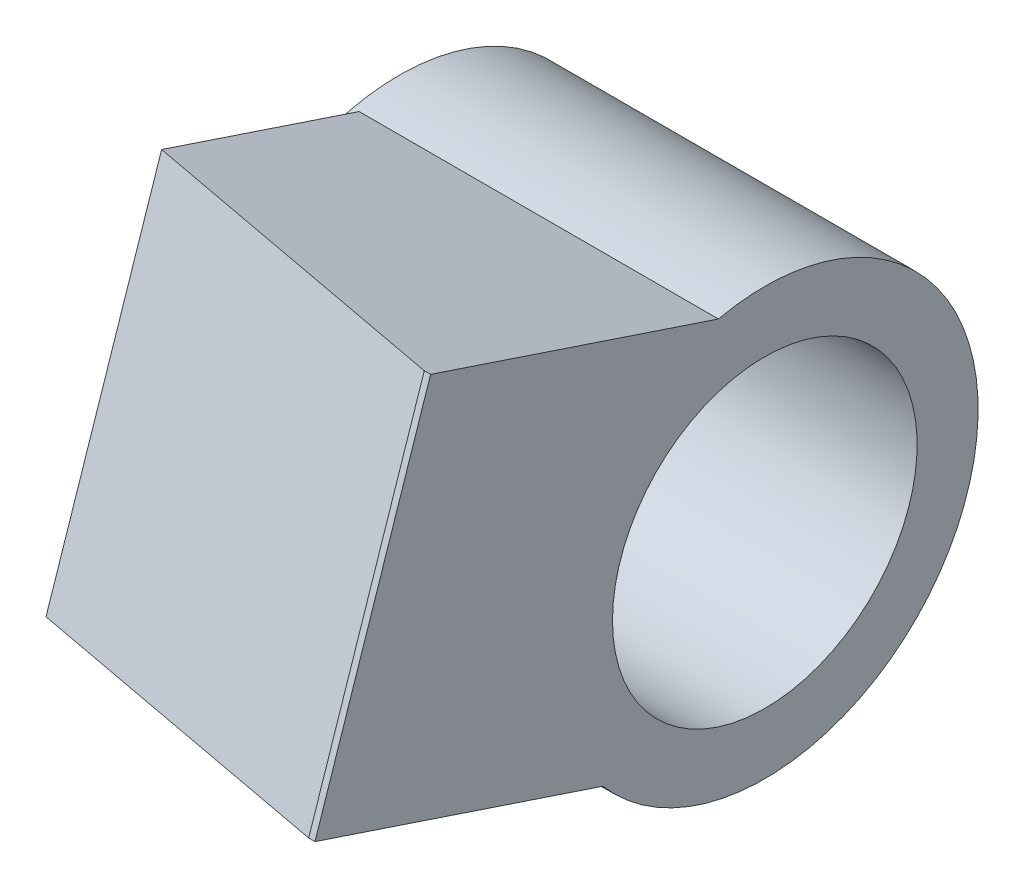
ISO-10303-21;
HEADER;
FILE_DESCRIPTION(('STEP AP214'),'2;1');
FILE_NAME('part.step','',(''),(''),'','','');
FILE_SCHEMA(('AUTOMOTIVE_DESIGN { 1 0 10303 214 1 1 1 1 }'));
ENDSEC;
DATA;
#1=APPLICATION_CONTEXT('core data for automotive mechanical design processes');
#2=APPLICATION_PROTOCOL_DEFINITION('international standard','automotive_design',2000,#1);
#3=PRODUCT_CONTEXT('',#1,'mechanical');
#4=PRODUCT('Part','Part','',(#3));
#5=PRODUCT_RELATED_PRODUCT_CATEGORY('part','',(#4));
#6=PRODUCT_DEFINITION_FORMATION('','',#4);
#7=PRODUCT_DEFINITION_CONTEXT('part definition',#1,'design');
#8=PRODUCT_DEFINITION('design','',#6,#7);
#9=PRODUCT_DEFINITION_SHAPE('','',#8);
#10=(LENGTH_UNIT() NAMED_UNIT(*) SI_UNIT(.MILLI.,.METRE.));
#11=(NAMED_UNIT(*) PLANE_ANGLE_UNIT() SI_UNIT($,.RADIAN.));
#12=(NAMED_UNIT(*) SI_UNIT($,.STERADIAN.) SOLID_ANGLE_UNIT());
#13=UNCERTAINTY_MEASURE_WITH_UNIT(LENGTH_MEASURE(1.E-05),#10,'distance_accuracy_value','');
#14=(GEOMETRIC_REPRESENTATION_CONTEXT(3) GLOBAL_UNCERTAINTY_ASSIGNED_CONTEXT((#13)) GLOBAL_UNIT_ASSIGNED_CONTEXT((#10,
#11,#12)) REPRESENTATION_CONTEXT('',''));
#15=CARTESIAN_POINT('',(0.,0.,0.));
#16=DIRECTION('',(0.,0.,1.));
#17=DIRECTION('',(1.,0.,0.));
#18=AXIS2_PLACEMENT_3D('',#15,#16,#17);
#19=CARTESIAN_POINT('',(63.5,-76.2,-228.6));
#20=DIRECTION('',(-1.,0.,0.));
#21=DIRECTION('',(0.,0.,1.));
#22=AXIS2_PLACEMENT_3D('',#19,#20,#21);
#23=CYLINDRICAL_SURFACE('',#22,22.225);
#24=CARTESIAN_POINT('',(25.4,-76.2,-228.6));
#25=DIRECTION('',(1.,0.,0.));
#26=DIRECTION('',(0.,0.,-1.));
#27=AXIS2_PLACEMENT_3D('',#24,#25,#26);
#28=CIRCLE('',#27,22.225);
#29=CARTESIAN_POINT('',(25.4,-76.2,-250.825));
#30=VERTEX_POINT('',#29);
#31=EDGE_CURVE('E153',#30,#30,#28,.T.);
#32=ORIENTED_EDGE('',*,*,#31,.T.);
#33=EDGE_LOOP('',(#32));
#34=FACE_BOUND('',#33,.T.);
#35=CARTESIAN_POINT('',(63.5,-76.2,-228.6));
#36=DIRECTION('',(1.,0.,0.));
#37=DIRECTION('',(0.,0.,-1.));
#38=AXIS2_PLACEMENT_3D('',#35,#36,#37);
#39=CIRCLE('',#38,22.225);
#40=CARTESIAN_POINT('',(63.5,-90.6523598531805,-211.715690133246));
#41=VERTEX_POINT('',#40);
#42=CARTESIAN_POINT('',(63.5,-54.5075261974108,-223.763968018586));
#43=VERTEX_POINT('',#42);
#44=EDGE_CURVE('E131',#41,#43,#39,.T.);
#45=ORIENTED_EDGE('',*,*,#44,.F.);
#46=DIRECTION('',(-1.,0.,0.));
#47=VECTOR('',#46,1.);
#48=CARTESIAN_POINT('',(63.5,-90.6523598531201,-211.715690133265));
#49=LINE('',#48,#47);
#50=CARTESIAN_POINT('',(26.0575453925426,-90.6523598531201,-211.715690133265));
#51=VERTEX_POINT('',#50);
#52=EDGE_CURVE('E240',#51,#41,#49,.F.);
#53=ORIENTED_EDGE('',*,*,#52,.F.);
#54=CARTESIAN_POINT('',(26.0575453925426,-76.2,-228.6));
#55=DIRECTION('',(-1.,0.,0.));
#56=DIRECTION('',(0.,0.,1.));
#57=AXIS2_PLACEMENT_3D('',#54,#55,#56);
#58=CIRCLE('',#57,22.225);
#59=CARTESIAN_POINT('',(26.0575453925426,-54.507526197451,-223.763968018538));
#60=VERTEX_POINT('',#59);
#61=EDGE_CURVE('E133',#60,#51,#58,.F.);
#62=ORIENTED_EDGE('',*,*,#61,.F.);
#63=DIRECTION('',(-1.,0.,0.));
#64=VECTOR('',#63,1.);
#65=CARTESIAN_POINT('',(63.5,-54.5075261974389,-223.763968018592));
#66=LINE('',#65,#64);
#67=EDGE_CURVE('E127',#43,#60,#66,.T.);
#68=ORIENTED_EDGE('',*,*,#67,.F.);
#69=EDGE_LOOP('',(#45,#53,#62,#68));
#70=FACE_BOUND('',#69,.T.);
#71=ADVANCED_FACE('F33',(#34,#70),#23,.T.);
#72=CARTESIAN_POINT('',(63.5,-76.2,-228.6));
#73=DIRECTION('',(-1.,0.,0.));
#74=DIRECTION('',(0.,0.,1.));
#75=AXIS2_PLACEMENT_3D('',#72,#73,#74);
#76=CYLINDRICAL_SURFACE('',#75,15.875);
#77=CARTESIAN_POINT('',(63.5,-76.2,-228.6));
#78=DIRECTION('',(-1.,0.,0.));
#79=DIRECTION('',(0.,0.,1.));
#80=AXIS2_PLACEMENT_3D('',#77,#78,#79);
#81=CIRCLE('',#80,15.875);
#82=CARTESIAN_POINT('',(63.5,-76.2,-212.725));
#83=VERTEX_POINT('',#82);
#84=EDGE_CURVE('E136',#83,#83,#81,.T.);
#85=ORIENTED_EDGE('',*,*,#84,.F.);
#86=EDGE_LOOP('',(#85));
#87=FACE_BOUND('',#86,.T.);
#88=CARTESIAN_POINT('',(27.94,-76.2,-228.6));
#89=DIRECTION('',(-1.,0.,0.));
#90=DIRECTION('',(0.,0.,1.));
#91=AXIS2_PLACEMENT_3D('',#88,#89,#90);
#92=CIRCLE('',#91,15.875);
#93=CARTESIAN_POINT('',(27.94,-76.2,-212.725));
#94=VERTEX_POINT('',#93);
#95=EDGE_CURVE('E163',#94,#94,#92,.F.);
#96=ORIENTED_EDGE('',*,*,#95,.F.);
#97=EDGE_LOOP('',(#96));
#98=FACE_BOUND('',#97,.T.);
#99=ADVANCED_FACE('F299',(#87,#98),#76,.F.);
#100=CARTESIAN_POINT('',(63.5,-76.2,-228.6));
#101=DIRECTION('',(1.,0.,0.));
#102=DIRECTION('',(0.,0.,-1.));
#103=AXIS2_PLACEMENT_3D('',#100,#101,#102);
#104=PLANE('',#103);
#105=ORIENTED_EDGE('',*,*,#84,.T.);
#106=EDGE_LOOP('',(#105));
#107=FACE_BOUND('',#106,.T.);
#108=ORIENTED_EDGE('',*,*,#44,.T.);
#109=DIRECTION('',(0.,0.316227766016081,0.948683298050766));
#110=VECTOR('',#109,1.);
#111=CARTESIAN_POINT('',(63.5,-54.5075261974348,-223.763968018591));
#112=LINE('',#111,#110);
#113=CARTESIAN_POINT('',(63.5,-44.5102255084077,-193.77206595143));
#114=VERTEX_POINT('',#113);
#115=EDGE_CURVE('E139',#43,#114,#112,.T.);
#116=ORIENTED_EDGE('',*,*,#115,.T.);
#117=DIRECTION('',(0.,-0.948683298050514,0.316227766016838));
#118=VECTOR('',#117,1.);
#119=CARTESIAN_POINT('',(63.5,-44.5102255084077,-193.77206595143));
#120=LINE('',#119,#118);
#121=CARTESIAN_POINT('',(63.5,-80.6550591641322,-181.723788066189));
#122=VERTEX_POINT('',#121);
#123=EDGE_CURVE('E146',#114,#122,#120,.T.);
#124=ORIENTED_EDGE('',*,*,#123,.T.);
#125=DIRECTION('',(0.,-0.316227766017664,-0.948683298050239));
#126=VECTOR('',#125,1.);
#127=CARTESIAN_POINT('',(63.5,-80.6550591641322,-181.723788066189));
#128=LINE('',#127,#126);
#129=EDGE_CURVE('E151',#122,#41,#128,.T.);
#130=ORIENTED_EDGE('',*,*,#129,.T.);
#131=EDGE_LOOP('',(#108,#116,#124,#130));
#132=FACE_BOUND('',#131,.T.);
#133=ADVANCED_FACE('F150',(#107,#132),#104,.T.);
#134=CARTESIAN_POINT('',(25.4,-76.2,-228.6));
#135=DIRECTION('',(1.,0.,0.));
#136=DIRECTION('',(0.,0.,-1.));
#137=AXIS2_PLACEMENT_3D('',#134,#135,#136);
#138=PLANE('',#137);
#139=DIRECTION('',(0.,0.316227766017141,0.948683298050413));
#140=VECTOR('',#139,1.);
#141=CARTESIAN_POINT('',(25.4,-95.1739450456941,-230.300561496384));
#142=LINE('',#141,#140);
#143=CARTESIAN_POINT('',(25.4,-94.7106645755414,-228.910720085927));
#144=VERTEX_POINT('',#143);
#145=CARTESIAN_POINT('',(25.4,-90.8220996088694,-217.245025185924));
#146=VERTEX_POINT('',#145);
#147=EDGE_CURVE('E199',#144,#146,#142,.T.);
#148=ORIENTED_EDGE('',*,*,#147,.F.);
#149=CARTESIAN_POINT('',(25.4,-88.6865256329213,-230.918766400136));
#150=DIRECTION('',(1.,0.,0.));
#151=DIRECTION('',(0.,0.,-1.));
#152=AXIS2_PLACEMENT_3D('',#149,#150,#151);
#153=CIRCLE('',#152,6.35);
#154=CARTESIAN_POINT('',(25.4,-94.9297884493819,-232.078149600204));
#155=VERTEX_POINT('',#154);
#156=EDGE_CURVE('E191',#144,#155,#153,.T.);
#157=ORIENTED_EDGE('',*,*,#156,.T.);
#158=CARTESIAN_POINT('',(25.4,-76.2,-228.6));
#159=DIRECTION('',(-1.,0.,0.));
#160=DIRECTION('',(0.,0.,1.));
#161=AXIS2_PLACEMENT_3D('',#158,#159,#160);
#162=CIRCLE('',#161,19.05);
#163=CARTESIAN_POINT('',(25.4,-63.3030590006263,-242.620392749801));
#164=VERTEX_POINT('',#163);
#165=EDGE_CURVE('E210',#164,#155,#162,.T.);
#166=ORIENTED_EDGE('',*,*,#165,.F.);
#167=CARTESIAN_POINT('',(25.4,-67.6020393337509,-237.946928499867));
#168=DIRECTION('',(1.,0.,0.));
#169=DIRECTION('',(0.,0.,-1.));
#170=AXIS2_PLACEMENT_3D('',#167,#168,#169);
#171=CIRCLE('',#170,6.35);
#172=CARTESIAN_POINT('',(25.4,-61.5779003911308,-239.954974814076));
#173=VERTEX_POINT('',#172);
#174=EDGE_CURVE('E41',#164,#173,#171,.T.);
#175=ORIENTED_EDGE('',*,*,#174,.T.);
#176=DIRECTION('',(0.,-0.316227766017144,-0.948683298050412));
#177=VECTOR('',#176,1.);
#178=CARTESIAN_POINT('',(25.4,-62.0411808612834,-241.344816224533));
#179=LINE('',#178,#177);
#180=CARTESIAN_POINT('',(25.4,-57.6893354244587,-228.289279914072));
#181=VERTEX_POINT('',#180);
#182=EDGE_CURVE('E236',#181,#173,#179,.T.);
#183=ORIENTED_EDGE('',*,*,#182,.F.);
#184=CARTESIAN_POINT('',(25.4,-63.7134743670788,-226.281233599864));
#185=DIRECTION('',(1.,0.,0.));
#186=DIRECTION('',(0.,0.,-1.));
#187=AXIS2_PLACEMENT_3D('',#184,#185,#186);
#188=CIRCLE('',#187,6.35);
#189=CARTESIAN_POINT('',(25.4,-57.4702115506182,-225.121850399795));
#190=VERTEX_POINT('',#189);
#191=EDGE_CURVE('E11',#181,#190,#188,.T.);
#192=ORIENTED_EDGE('',*,*,#191,.T.);
#193=CARTESIAN_POINT('',(25.4,-76.2000000000001,-228.6));
#194=DIRECTION('',(-1.,0.,0.));
#195=DIRECTION('',(0.,0.,1.));
#196=AXIS2_PLACEMENT_3D('',#193,#194,#195);
#197=CIRCLE('',#196,19.05);
#198=CARTESIAN_POINT('',(25.4,-89.0969409993738,-214.579607250199));
#199=VERTEX_POINT('',#198);
#200=EDGE_CURVE('E201',#199,#190,#197,.T.);
#201=ORIENTED_EDGE('',*,*,#200,.F.);
#202=CARTESIAN_POINT('',(25.4,-84.7979606662492,-219.253071500133));
#203=DIRECTION('',(1.,0.,0.));
#204=DIRECTION('',(0.,0.,-1.));
#205=AXIS2_PLACEMENT_3D('',#202,#203,#204);
#206=CIRCLE('',#205,6.35);
#207=EDGE_CURVE('E193',#199,#146,#206,.T.);
#208=ORIENTED_EDGE('',*,*,#207,.T.);
#209=EDGE_LOOP('',(#148,#157,#166,#175,#183,#192,#201,#208));
#210=FACE_BOUND('',#209,.T.);
#211=ORIENTED_EDGE('',*,*,#31,.F.);
#212=EDGE_LOOP('',(#211));
#213=FACE_BOUND('',#212,.T.);
#214=ADVANCED_FACE('F197',(#210,#213),#138,.F.);
#215=CARTESIAN_POINT('',(26.0575453925426,-166653.74045571,-500021.462756556));
#216=DIRECTION('',(0.,0.948683298050514,-0.316227766016838));
#217=DIRECTION('',(0.,0.316227766016838,0.948683298050514));
#218=AXIS2_PLACEMENT_3D('',#215,#216,#217);
#219=PLANE('',#218);
#220=DIRECTION('',(-0.965483181493824,-0.0823663925715845,-0.247099177714753));
#221=VECTOR('',#220,1.);
#222=CARTESIAN_POINT('',(26.0575453925426,-47.648385065385,-203.186544622362));
#223=LINE('',#222,#221);
#224=CARTESIAN_POINT('',(62.8424546074573,-44.5102255084077,-193.77206595143));
#225=VERTEX_POINT('',#224);
#226=CARTESIAN_POINT('',(26.0575453925426,-47.648385065385,-203.186544622362));
#227=VERTEX_POINT('',#226);
#228=EDGE_CURVE('E246',#225,#227,#223,.T.);
#229=ORIENTED_EDGE('',*,*,#228,.F.);
#230=DIRECTION('',(-1.,0.,0.));
#231=VECTOR('',#230,1.);
#232=CARTESIAN_POINT('',(125.921737338214,-44.5102255084077,-193.77206595143));
#233=LINE('',#232,#231);
#234=EDGE_CURVE('E142',#114,#225,#233,.T.);
#235=ORIENTED_EDGE('',*,*,#234,.F.);
#236=ORIENTED_EDGE('',*,*,#115,.F.);
#237=ORIENTED_EDGE('',*,*,#67,.T.);
#238=DIRECTION('',(0.,0.316227766016838,0.948683298050514));
#239=VECTOR('',#238,1.);
#240=CARTESIAN_POINT('',(26.0575453925426,-166653.74045571,-500021.462756556));
#241=LINE('',#240,#239);
#242=EDGE_CURVE('E242',#60,#227,#241,.T.);
#243=ORIENTED_EDGE('',*,*,#242,.T.);
#244=EDGE_LOOP('',(#229,#235,#236,#237,#243));
#245=FACE_BOUND('',#244,.T.);
#246=ADVANCED_FACE('F141',(#245),#219,.T.);
#247=CARTESIAN_POINT('',(26.0575453925426,-166689.885289366,-500009.414478671));
#248=DIRECTION('',(-1.,0.,0.));
#249=DIRECTION('',(0.,0.,1.));
#250=AXIS2_PLACEMENT_3D('',#247,#248,#249);
#251=PLANE('',#250);
#252=CARTESIAN_POINT('',(26.0575453925426,-67.163791586058,-201.49137475821));
#253=DIRECTION('',(-1.,0.,0.));
#254=DIRECTION('',(0.,0.,1.));
#255=AXIS2_PLACEMENT_3D('',#252,#253,#254);
#256=CIRCLE('',#255,2.01929999999999);
#257=CARTESIAN_POINT('',(26.0575453925426,-67.163791586058,-199.47207475821));
#258=VERTEX_POINT('',#257);
#259=EDGE_CURVE('E233',#258,#258,#256,.T.);
#260=ORIENTED_EDGE('',*,*,#259,.F.);
#261=EDGE_LOOP('',(#260));
#262=FACE_BOUND('',#261,.T.);
#263=ORIENTED_EDGE('',*,*,#242,.F.);
#264=ORIENTED_EDGE('',*,*,#61,.T.);
#265=DIRECTION('',(0.,0.316227766016838,0.948683298050514));
#266=VECTOR('',#265,1.);
#267=CARTESIAN_POINT('',(26.0575453925426,-166689.885289366,-500009.414478671));
#268=LINE('',#267,#266);
#269=CARTESIAN_POINT('',(26.0575453925426,-83.7932187211096,-191.138266737121));
#270=VERTEX_POINT('',#269);
#271=EDGE_CURVE('E254',#51,#270,#268,.T.);
#272=ORIENTED_EDGE('',*,*,#271,.T.);
#273=DIRECTION('',(0.,-0.948683298050514,0.316227766016838));
#274=VECTOR('',#273,1.);
#275=CARTESIAN_POINT('',(26.0575453925426,-83.7932187211096,-191.138266737121));
#276=LINE('',#275,#274);
#277=EDGE_CURVE('E243',#227,#270,#276,.T.);
#278=ORIENTED_EDGE('',*,*,#277,.F.);
#279=EDGE_LOOP('',(#263,#264,#272,#278));
#280=FACE_BOUND('',#279,.T.);
#281=ADVANCED_FACE('F258',(#262,#280),#251,.T.);
#282=CARTESIAN_POINT('',(26.0575453925426,-166689.885289366,-500009.414478671));
#283=DIRECTION('',(0.,-0.948683298050514,0.316227766016838));
#284=DIRECTION('',(0.,-0.316227766016838,-0.948683298050514));
#285=AXIS2_PLACEMENT_3D('',#282,#283,#284);
#286=PLANE('',#285);
#287=ORIENTED_EDGE('',*,*,#271,.F.);
#288=ORIENTED_EDGE('',*,*,#52,.T.);
#289=ORIENTED_EDGE('',*,*,#129,.F.);
#290=DIRECTION('',(-1.,0.,0.));
#291=VECTOR('',#290,1.);
#292=CARTESIAN_POINT('',(125.921737338214,-80.6550591641322,-181.723788066189));
#293=LINE('',#292,#291);
#294=CARTESIAN_POINT('',(62.8424546074573,-80.6550591641322,-181.723788066189));
#295=VERTEX_POINT('',#294);
#296=EDGE_CURVE('E147',#122,#295,#293,.T.);
#297=ORIENTED_EDGE('',*,*,#296,.T.);
#298=DIRECTION('',(0.965483181493824,0.0823663925715845,0.247099177714753));
#299=VECTOR('',#298,1.);
#300=CARTESIAN_POINT('',(26.0575453925426,-83.7932187211096,-191.138266737121));
#301=LINE('',#300,#299);
#302=EDGE_CURVE('E247',#270,#295,#301,.T.);
#303=ORIENTED_EDGE('',*,*,#302,.F.);
#304=EDGE_LOOP('',(#287,#288,#289,#297,#303));
#305=FACE_BOUND('',#304,.T.);
#306=ADVANCED_FACE('F260',(#305),#286,.T.);
#307=CARTESIAN_POINT('',(54.0311962095207,-63.3343401205143,-190.003020361542));
#308=DIRECTION('',(0.26046540317778,-0.305312589610622,-0.915937768831864));
#309=DIRECTION('',(0.,0.948683298050514,-0.316227766016838));
#310=AXIS2_PLACEMENT_3D('',#307,#308,#309);
#311=PLANE('',#310);
#312=DIRECTION('',(0.,0.948683298050514,-0.316227766016838));
#313=VECTOR('',#312,1.);
#314=CARTESIAN_POINT('',(62.8424546074573,-80.6550591641322,-181.723788066189));
#315=LINE('',#314,#313);
#316=EDGE_CURVE('E158',#295,#225,#315,.T.);
#317=ORIENTED_EDGE('',*,*,#316,.T.);
#318=ORIENTED_EDGE('',*,*,#228,.T.);
#319=ORIENTED_EDGE('',*,*,#277,.T.);
#320=ORIENTED_EDGE('',*,*,#302,.T.);
#321=EDGE_LOOP('',(#317,#318,#319,#320));
#322=FACE_BOUND('',#321,.T.);
#323=ADVANCED_FACE('F264',(#322),#311,.F.);
#324=CARTESIAN_POINT('',(27.94,-76.2,-228.6));
#325=DIRECTION('',(-1.,0.,0.));
#326=DIRECTION('',(0.,0.,1.));
#327=AXIS2_PLACEMENT_3D('',#324,#325,#326);
#328=PLANE('',#327);
#329=CARTESIAN_POINT('',(27.94,-76.2,-228.6));
#330=DIRECTION('',(-1.,0.,0.));
#331=DIRECTION('',(0.,0.,1.));
#332=AXIS2_PLACEMENT_3D('',#329,#330,#331);
#333=CIRCLE('',#332,19.05);
#334=CARTESIAN_POINT('',(27.94,-63.3030590006263,-242.620392749801));
#335=VERTEX_POINT('',#334);
#336=CARTESIAN_POINT('',(27.94,-94.9297884493819,-232.078149600204));
#337=VERTEX_POINT('',#336);
#338=EDGE_CURVE('E228',#335,#337,#333,.T.);
#339=ORIENTED_EDGE('',*,*,#338,.T.);
#340=CARTESIAN_POINT('',(27.94,-88.6865256329213,-230.918766400136));
#341=DIRECTION('',(-1.,0.,0.));
#342=DIRECTION('',(0.,0.,1.));
#343=AXIS2_PLACEMENT_3D('',#340,#341,#342);
#344=CIRCLE('',#343,6.35);
#345=CARTESIAN_POINT('',(27.94,-94.7106645755414,-228.910720085927));
#346=VERTEX_POINT('',#345);
#347=EDGE_CURVE('E180',#337,#346,#344,.T.);
#348=ORIENTED_EDGE('',*,*,#347,.T.);
#349=DIRECTION('',(0.,0.316227766017141,0.948683298050413));
#350=VECTOR('',#349,1.);
#351=CARTESIAN_POINT('',(27.94,-95.1739450456941,-230.300561496384));
#352=LINE('',#351,#350);
#353=CARTESIAN_POINT('',(27.94,-90.8220996088694,-217.245025185924));
#354=VERTEX_POINT('',#353);
#355=EDGE_CURVE('E222',#346,#354,#352,.T.);
#356=ORIENTED_EDGE('',*,*,#355,.T.);
#357=CARTESIAN_POINT('',(27.94,-84.7979606662492,-219.253071500133));
#358=DIRECTION('',(-1.,0.,0.));
#359=DIRECTION('',(0.,0.,1.));
#360=AXIS2_PLACEMENT_3D('',#357,#358,#359);
#361=CIRCLE('',#360,6.35);
#362=CARTESIAN_POINT('',(27.94,-89.0969409993738,-214.579607250199));
#363=VERTEX_POINT('',#362);
#364=EDGE_CURVE('E178',#354,#363,#361,.T.);
#365=ORIENTED_EDGE('',*,*,#364,.T.);
#366=CARTESIAN_POINT('',(27.94,-76.2000000000001,-228.6));
#367=DIRECTION('',(-1.,0.,0.));
#368=DIRECTION('',(0.,0.,1.));
#369=AXIS2_PLACEMENT_3D('',#366,#367,#368);
#370=CIRCLE('',#369,19.05);
#371=CARTESIAN_POINT('',(27.94,-57.4702115506182,-225.121850399795));
#372=VERTEX_POINT('',#371);
#373=EDGE_CURVE('E220',#363,#372,#370,.T.);
#374=ORIENTED_EDGE('',*,*,#373,.T.);
#375=CARTESIAN_POINT('',(27.94,-63.7134743670788,-226.281233599864));
#376=DIRECTION('',(-1.,0.,0.));
#377=DIRECTION('',(0.,0.,1.));
#378=AXIS2_PLACEMENT_3D('',#375,#376,#377);
#379=CIRCLE('',#378,6.35);
#380=CARTESIAN_POINT('',(27.94,-57.6893354244587,-228.289279914072));
#381=VERTEX_POINT('',#380);
#382=EDGE_CURVE('E174',#372,#381,#379,.T.);
#383=ORIENTED_EDGE('',*,*,#382,.T.);
#384=DIRECTION('',(0.,-0.316227766017144,-0.948683298050412));
#385=VECTOR('',#384,1.);
#386=CARTESIAN_POINT('',(27.94,-62.0411808612834,-241.344816224533));
#387=LINE('',#386,#385);
#388=CARTESIAN_POINT('',(27.94,-61.5779003911308,-239.954974814076));
#389=VERTEX_POINT('',#388);
#390=EDGE_CURVE('E165',#381,#389,#387,.T.);
#391=ORIENTED_EDGE('',*,*,#390,.T.);
#392=CARTESIAN_POINT('',(27.94,-67.6020393337509,-237.946928499867));
#393=DIRECTION('',(-1.,0.,0.));
#394=DIRECTION('',(0.,0.,1.));
#395=AXIS2_PLACEMENT_3D('',#392,#393,#394);
#396=CIRCLE('',#395,6.35);
#397=EDGE_CURVE('E176',#389,#335,#396,.T.);
#398=ORIENTED_EDGE('',*,*,#397,.T.);
#399=EDGE_LOOP('',(#339,#348,#356,#365,#374,#383,#391,#398));
#400=FACE_BOUND('',#399,.T.);
#401=ORIENTED_EDGE('',*,*,#95,.T.);
#402=EDGE_LOOP('',(#401));
#403=FACE_BOUND('',#402,.T.);
#404=ADVANCED_FACE('F218',(#400,#403),#328,.T.);
#405=CARTESIAN_POINT('',(27.94,-76.2,-228.6));
#406=DIRECTION('',(-1.,0.,0.));
#407=DIRECTION('',(0.,0.,1.));
#408=AXIS2_PLACEMENT_3D('',#405,#406,#407);
#409=CYLINDRICAL_SURFACE('',#408,19.05);
#410=ORIENTED_EDGE('',*,*,#165,.T.);
#411=DIRECTION('',(-1.,0.,0.));
#412=VECTOR('',#411,1.);
#413=CARTESIAN_POINT('',(27.94,-94.9297884493819,-232.078149600204));
#414=LINE('',#413,#412);
#415=EDGE_CURVE('E172',#155,#337,#414,.F.);
#416=ORIENTED_EDGE('',*,*,#415,.T.);
#417=ORIENTED_EDGE('',*,*,#338,.F.);
#418=DIRECTION('',(-1.,0.,0.));
#419=VECTOR('',#418,1.);
#420=CARTESIAN_POINT('',(27.94,-63.3030590006263,-242.620392749801));
#421=LINE('',#420,#419);
#422=EDGE_CURVE('E169',#335,#164,#421,.T.);
#423=ORIENTED_EDGE('',*,*,#422,.T.);
#424=EDGE_LOOP('',(#410,#416,#417,#423));
#425=FACE_BOUND('',#424,.T.);
#426=ADVANCED_FACE('F282',(#425),#409,.F.);
#427=CARTESIAN_POINT('',(27.94,-62.0411808612834,-241.344816224533));
#428=DIRECTION('',(0.,0.948683298050412,-0.316227766017144));
#429=DIRECTION('',(0.,0.316227766017144,0.948683298050412));
#430=AXIS2_PLACEMENT_3D('',#427,#428,#429);
#431=PLANE('',#430);
#432=ORIENTED_EDGE('',*,*,#182,.T.);
#433=DIRECTION('',(1.,0.,0.));
#434=VECTOR('',#433,1.);
#435=CARTESIAN_POINT('',(27.94,-61.5779003911308,-239.954974814076));
#436=LINE('',#435,#434);
#437=EDGE_CURVE('E189',#173,#389,#436,.T.);
#438=ORIENTED_EDGE('',*,*,#437,.T.);
#439=ORIENTED_EDGE('',*,*,#390,.F.);
#440=DIRECTION('',(1.,0.,0.));
#441=VECTOR('',#440,1.);
#442=CARTESIAN_POINT('',(25.4,-57.6893354244587,-228.289279914072));
#443=LINE('',#442,#441);
#444=EDGE_CURVE('E187',#381,#181,#443,.F.);
#445=ORIENTED_EDGE('',*,*,#444,.T.);
#446=EDGE_LOOP('',(#432,#438,#439,#445));
#447=FACE_BOUND('',#446,.T.);
#448=ADVANCED_FACE('F288',(#447),#431,.F.);
#449=CARTESIAN_POINT('',(27.94,-76.2000000000001,-228.6));
#450=DIRECTION('',(-1.,0.,0.));
#451=DIRECTION('',(0.,0.,1.));
#452=AXIS2_PLACEMENT_3D('',#449,#450,#451);
#453=CYLINDRICAL_SURFACE('',#452,19.05);
#454=ORIENTED_EDGE('',*,*,#373,.F.);
#455=DIRECTION('',(-1.,0.,0.));
#456=VECTOR('',#455,1.);
#457=CARTESIAN_POINT('',(27.94,-89.0969409993738,-214.579607250199));
#458=LINE('',#457,#456);
#459=EDGE_CURVE('E184',#363,#199,#458,.T.);
#460=ORIENTED_EDGE('',*,*,#459,.T.);
#461=ORIENTED_EDGE('',*,*,#200,.T.);
#462=DIRECTION('',(-1.,0.,0.));
#463=VECTOR('',#462,1.);
#464=CARTESIAN_POINT('',(27.94,-57.4702115506182,-225.121850399795));
#465=LINE('',#464,#463);
#466=EDGE_CURVE('E182',#190,#372,#465,.F.);
#467=ORIENTED_EDGE('',*,*,#466,.T.);
#468=EDGE_LOOP('',(#454,#460,#461,#467));
#469=FACE_BOUND('',#468,.T.);
#470=ADVANCED_FACE('F224',(#469),#453,.F.);
#471=CARTESIAN_POINT('',(27.94,-95.1739450456941,-230.300561496384));
#472=DIRECTION('',(0.,-0.948683298050413,0.316227766017141));
#473=DIRECTION('',(0.,-0.316227766017141,-0.948683298050413));
#474=AXIS2_PLACEMENT_3D('',#471,#472,#473);
#475=PLANE('',#474);
#476=ORIENTED_EDGE('',*,*,#355,.F.);
#477=DIRECTION('',(1.,0.,0.));
#478=VECTOR('',#477,1.);
#479=CARTESIAN_POINT('',(25.4,-94.7106645755414,-228.910720085927));
#480=LINE('',#479,#478);
#481=EDGE_CURVE('E155',#346,#144,#480,.F.);
#482=ORIENTED_EDGE('',*,*,#481,.T.);
#483=ORIENTED_EDGE('',*,*,#147,.T.);
#484=DIRECTION('',(1.,0.,0.));
#485=VECTOR('',#484,1.);
#486=CARTESIAN_POINT('',(27.94,-90.8220996088694,-217.245025185924));
#487=LINE('',#486,#485);
#488=EDGE_CURVE('E152',#146,#354,#487,.T.);
#489=ORIENTED_EDGE('',*,*,#488,.T.);
#490=EDGE_LOOP('',(#476,#482,#483,#489));
#491=FACE_BOUND('',#490,.T.);
#492=ADVANCED_FACE('F207',(#491),#475,.F.);
#493=CARTESIAN_POINT('',(27.94,-88.6865256329213,-230.918766400136));
#494=DIRECTION('',(-1.,0.,0.));
#495=DIRECTION('',(0.,0.,1.));
#496=AXIS2_PLACEMENT_3D('',#493,#494,#495);
#497=CYLINDRICAL_SURFACE('',#496,6.35);
#498=ORIENTED_EDGE('',*,*,#347,.F.);
#499=ORIENTED_EDGE('',*,*,#415,.F.);
#500=ORIENTED_EDGE('',*,*,#156,.F.);
#501=ORIENTED_EDGE('',*,*,#481,.F.);
#502=EDGE_LOOP('',(#498,#499,#500,#501));
#503=FACE_BOUND('',#502,.T.);
#504=ADVANCED_FACE('F281',(#503),#497,.F.);
#505=CARTESIAN_POINT('',(27.94,-84.7979606662492,-219.253071500133));
#506=DIRECTION('',(-1.,0.,0.));
#507=DIRECTION('',(0.,0.,1.));
#508=AXIS2_PLACEMENT_3D('',#505,#506,#507);
#509=CYLINDRICAL_SURFACE('',#508,6.35);
#510=ORIENTED_EDGE('',*,*,#364,.F.);
#511=ORIENTED_EDGE('',*,*,#488,.F.);
#512=ORIENTED_EDGE('',*,*,#207,.F.);
#513=ORIENTED_EDGE('',*,*,#459,.F.);
#514=EDGE_LOOP('',(#510,#511,#512,#513));
#515=FACE_BOUND('',#514,.T.);
#516=ADVANCED_FACE('F213',(#515),#509,.F.);
#517=CARTESIAN_POINT('',(27.94,-67.6020393337509,-237.946928499867));
#518=DIRECTION('',(-1.,0.,0.));
#519=DIRECTION('',(0.,0.,1.));
#520=AXIS2_PLACEMENT_3D('',#517,#518,#519);
#521=CYLINDRICAL_SURFACE('',#520,6.35);
#522=ORIENTED_EDGE('',*,*,#397,.F.);
#523=ORIENTED_EDGE('',*,*,#437,.F.);
#524=ORIENTED_EDGE('',*,*,#174,.F.);
#525=ORIENTED_EDGE('',*,*,#422,.F.);
#526=EDGE_LOOP('',(#522,#523,#524,#525));
#527=FACE_BOUND('',#526,.T.);
#528=ADVANCED_FACE('F284',(#527),#521,.F.);
#529=CARTESIAN_POINT('',(27.94,-63.7134743670788,-226.281233599864));
#530=DIRECTION('',(-1.,0.,0.));
#531=DIRECTION('',(0.,0.,1.));
#532=AXIS2_PLACEMENT_3D('',#529,#530,#531);
#533=CYLINDRICAL_SURFACE('',#532,6.35);
#534=ORIENTED_EDGE('',*,*,#382,.F.);
#535=ORIENTED_EDGE('',*,*,#466,.F.);
#536=ORIENTED_EDGE('',*,*,#191,.F.);
#537=ORIENTED_EDGE('',*,*,#444,.F.);
#538=EDGE_LOOP('',(#534,#535,#536,#537));
#539=FACE_BOUND('',#538,.T.);
#540=ADVANCED_FACE('F35',(#539),#533,.F.);
#541=CARTESIAN_POINT('',(26.0575453925426,-67.163791586058,-201.49137475821));
#542=DIRECTION('',(-1.,0.,0.));
#543=DIRECTION('',(0.,0.,1.));
#544=AXIS2_PLACEMENT_3D('',#541,#542,#543);
#545=CYLINDRICAL_SURFACE('',#544,2.01929999999999);
#546=ORIENTED_EDGE('',*,*,#259,.T.);
#547=EDGE_LOOP('',(#546));
#548=FACE_BOUND('',#547,.T.);
#549=CARTESIAN_POINT('',(62.8424546074573,-67.163791586058,-201.49137475821));
#550=DIRECTION('',(1.,0.,0.));
#551=DIRECTION('',(0.,0.,-1.));
#552=AXIS2_PLACEMENT_3D('',#549,#550,#551);
#553=CIRCLE('',#552,2.01929999999999);
#554=CARTESIAN_POINT('',(62.8424546074573,-67.163791586058,-203.51067475821));
#555=VERTEX_POINT('',#554);
#556=EDGE_CURVE('E270',#555,#555,#553,.F.);
#557=ORIENTED_EDGE('',*,*,#556,.F.);
#558=EDGE_LOOP('',(#557));
#559=FACE_BOUND('',#558,.T.);
#560=ADVANCED_FACE('F290',(#548,#559),#545,.F.);
#561=CARTESIAN_POINT('',(62.8424546074573,-76.2,-228.6));
#562=DIRECTION('',(1.,0.,0.));
#563=DIRECTION('',(0.,0.,-1.));
#564=AXIS2_PLACEMENT_3D('',#561,#562,#563);
#565=PLANE('',#564);
#566=ORIENTED_EDGE('',*,*,#556,.T.);
#567=EDGE_LOOP('',(#566));
#568=FACE_BOUND('',#567,.T.);
#569=ADVANCED_FACE('F295',(#568),#565,.F.);
#570=CARTESIAN_POINT('',(125.921737338214,-44.5102255084077,-193.77206595143));
#571=DIRECTION('',(0.,-0.316227766016838,-0.948683298050514));
#572=DIRECTION('',(0.,0.948683298050514,-0.316227766016838));
#573=AXIS2_PLACEMENT_3D('',#570,#571,#572);
#574=PLANE('',#573);
#575=ORIENTED_EDGE('',*,*,#123,.F.);
#576=ORIENTED_EDGE('',*,*,#234,.T.);
#577=ORIENTED_EDGE('',*,*,#316,.F.);
#578=ORIENTED_EDGE('',*,*,#296,.F.);
#579=EDGE_LOOP('',(#575,#576,#577,#578));
#580=FACE_BOUND('',#579,.T.);
#581=ADVANCED_FACE('F266',(#580),#574,.F.);
#582=CLOSED_SHELL('',(#71,#99,#133,#214,#246,#281,#306,#323,#404,#426,#448,#470,#492,#504,#516,
#528,#540,#560,#569,#581));
#583=MANIFOLD_SOLID_BREP('B2',#582);
#584=ADVANCED_BREP_SHAPE_REPRESENTATION('',(#18,#583),#14);
#585=SHAPE_DEFINITION_REPRESENTATION(#9,#584);
ENDSEC;
END-ISO-10303-21;
